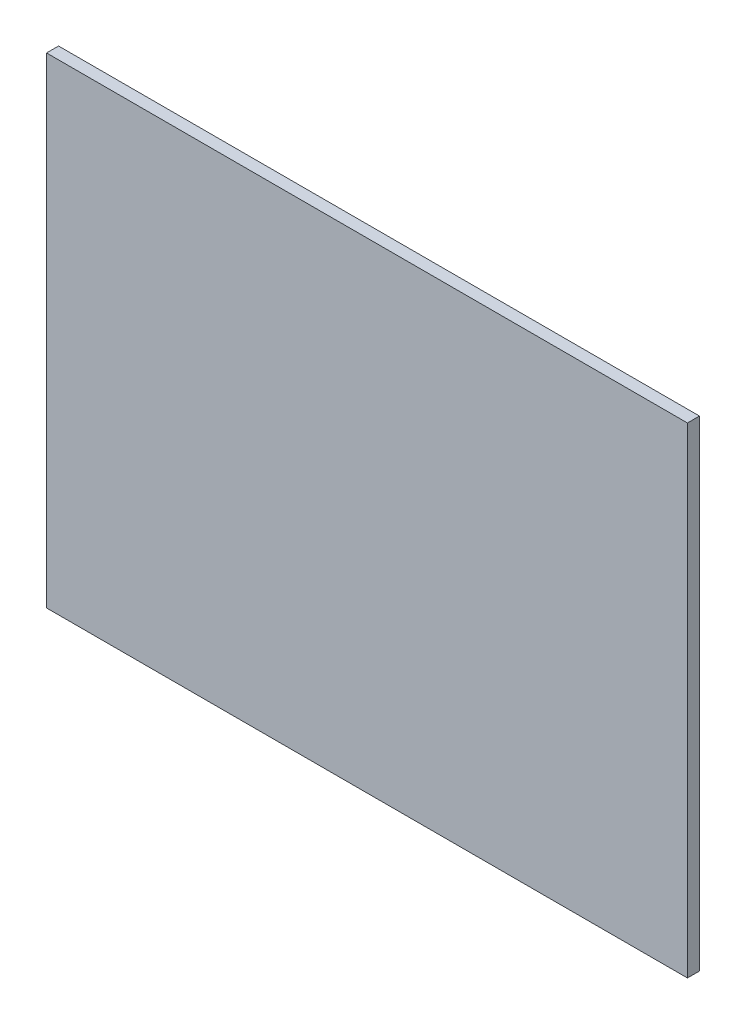
ISO-10303-21;
HEADER;
FILE_DESCRIPTION(('STEP AP214'),'2;1');
FILE_NAME('part.step','',(''),(''),'','','');
FILE_SCHEMA(('AUTOMOTIVE_DESIGN { 1 0 10303 214 1 1 1 1 }'));
ENDSEC;
DATA;
#1=APPLICATION_CONTEXT('core data for automotive mechanical design processes');
#2=APPLICATION_PROTOCOL_DEFINITION('international standard','automotive_design',2000,#1);
#3=PRODUCT_CONTEXT('',#1,'mechanical');
#4=PRODUCT('Part','Part','',(#3));
#5=PRODUCT_RELATED_PRODUCT_CATEGORY('part','',(#4));
#6=PRODUCT_DEFINITION_FORMATION('','',#4);
#7=PRODUCT_DEFINITION_CONTEXT('part definition',#1,'design');
#8=PRODUCT_DEFINITION('design','',#6,#7);
#9=PRODUCT_DEFINITION_SHAPE('','',#8);
#10=(LENGTH_UNIT() NAMED_UNIT(*) SI_UNIT(.MILLI.,.METRE.));
#11=(NAMED_UNIT(*) PLANE_ANGLE_UNIT() SI_UNIT($,.RADIAN.));
#12=(NAMED_UNIT(*) SI_UNIT($,.STERADIAN.) SOLID_ANGLE_UNIT());
#13=UNCERTAINTY_MEASURE_WITH_UNIT(LENGTH_MEASURE(1.E-05),#10,'distance_accuracy_value','');
#14=(GEOMETRIC_REPRESENTATION_CONTEXT(3) GLOBAL_UNCERTAINTY_ASSIGNED_CONTEXT((#13)) GLOBAL_UNIT_ASSIGNED_CONTEXT((#10,
#11,#12)) REPRESENTATION_CONTEXT('',''));
#15=CARTESIAN_POINT('',(0.,0.,0.));
#16=DIRECTION('',(0.,0.,1.));
#17=DIRECTION('',(1.,0.,0.));
#18=AXIS2_PLACEMENT_3D('',#15,#16,#17);
#19=CARTESIAN_POINT('',(0.,0.,19.05));
#20=DIRECTION('',(1.,0.,0.));
#21=DIRECTION('',(0.,0.,-1.));
#22=AXIS2_PLACEMENT_3D('',#19,#20,#21);
#23=PLANE('',#22);
#24=DIRECTION('',(0.,-1.,0.));
#25=VECTOR('',#24,1.);
#26=CARTESIAN_POINT('',(0.,0.,0.));
#27=LINE('',#26,#25);
#28=CARTESIAN_POINT('',(0.,762.,0.));
#29=VERTEX_POINT('',#28);
#30=CARTESIAN_POINT('',(0.,0.,0.));
#31=VERTEX_POINT('',#30);
#32=EDGE_CURVE('E96',#29,#31,#27,.T.);
#33=ORIENTED_EDGE('',*,*,#32,.T.);
#34=DIRECTION('',(0.,0.,-1.));
#35=VECTOR('',#34,1.);
#36=CARTESIAN_POINT('',(0.,0.,19.05));
#37=LINE('',#36,#35);
#38=CARTESIAN_POINT('',(0.,0.,19.05));
#39=VERTEX_POINT('',#38);
#40=EDGE_CURVE('E11',#39,#31,#37,.T.);
#41=ORIENTED_EDGE('',*,*,#40,.F.);
#42=DIRECTION('',(0.,-1.,0.));
#43=VECTOR('',#42,1.);
#44=CARTESIAN_POINT('',(0.,0.,19.05));
#45=LINE('',#44,#43);
#46=CARTESIAN_POINT('',(0.,762.,19.05));
#47=VERTEX_POINT('',#46);
#48=EDGE_CURVE('E84',#47,#39,#45,.T.);
#49=ORIENTED_EDGE('',*,*,#48,.F.);
#50=DIRECTION('',(0.,0.,-1.));
#51=VECTOR('',#50,1.);
#52=CARTESIAN_POINT('',(0.,762.,19.05));
#53=LINE('',#52,#51);
#54=EDGE_CURVE('E92',#47,#29,#53,.T.);
#55=ORIENTED_EDGE('',*,*,#54,.T.);
#56=EDGE_LOOP('',(#33,#41,#49,#55));
#57=FACE_BOUND('',#56,.T.);
#58=ADVANCED_FACE('F33',(#57),#23,.F.);
#59=CARTESIAN_POINT('',(0.,0.,19.05));
#60=DIRECTION('',(0.,1.,0.));
#61=DIRECTION('',(0.,0.,1.));
#62=AXIS2_PLACEMENT_3D('',#59,#60,#61);
#63=PLANE('',#62);
#64=DIRECTION('',(1.,0.,0.));
#65=VECTOR('',#64,1.);
#66=CARTESIAN_POINT('',(0.,0.,0.));
#67=LINE('',#66,#65);
#68=CARTESIAN_POINT('',(1016.,0.,0.));
#69=VERTEX_POINT('',#68);
#70=EDGE_CURVE('E88',#31,#69,#67,.T.);
#71=ORIENTED_EDGE('',*,*,#70,.T.);
#72=DIRECTION('',(0.,0.,-1.));
#73=VECTOR('',#72,1.);
#74=CARTESIAN_POINT('',(1016.,0.,19.05));
#75=LINE('',#74,#73);
#76=CARTESIAN_POINT('',(1016.,0.,19.05));
#77=VERTEX_POINT('',#76);
#78=EDGE_CURVE('E41',#77,#69,#75,.T.);
#79=ORIENTED_EDGE('',*,*,#78,.F.);
#80=DIRECTION('',(1.,0.,0.));
#81=VECTOR('',#80,1.);
#82=CARTESIAN_POINT('',(0.,0.,19.05));
#83=LINE('',#82,#81);
#84=EDGE_CURVE('E79',#39,#77,#83,.T.);
#85=ORIENTED_EDGE('',*,*,#84,.F.);
#86=ORIENTED_EDGE('',*,*,#40,.T.);
#87=EDGE_LOOP('',(#71,#79,#85,#86));
#88=FACE_BOUND('',#87,.T.);
#89=ADVANCED_FACE('F87',(#88),#63,.F.);
#90=CARTESIAN_POINT('',(1016.,0.,19.05));
#91=DIRECTION('',(-1.,0.,0.));
#92=DIRECTION('',(0.,0.,1.));
#93=AXIS2_PLACEMENT_3D('',#90,#91,#92);
#94=PLANE('',#93);
#95=DIRECTION('',(0.,1.,0.));
#96=VECTOR('',#95,1.);
#97=CARTESIAN_POINT('',(1016.,0.,0.));
#98=LINE('',#97,#96);
#99=CARTESIAN_POINT('',(1016.,762.,0.));
#100=VERTEX_POINT('',#99);
#101=EDGE_CURVE('E66',#69,#100,#98,.T.);
#102=ORIENTED_EDGE('',*,*,#101,.T.);
#103=DIRECTION('',(0.,0.,-1.));
#104=VECTOR('',#103,1.);
#105=CARTESIAN_POINT('',(1016.,762.,19.05));
#106=LINE('',#105,#104);
#107=CARTESIAN_POINT('',(1016.,762.,19.05));
#108=VERTEX_POINT('',#107);
#109=EDGE_CURVE('E89',#108,#100,#106,.T.);
#110=ORIENTED_EDGE('',*,*,#109,.F.);
#111=DIRECTION('',(0.,1.,0.));
#112=VECTOR('',#111,1.);
#113=CARTESIAN_POINT('',(1016.,0.,19.05));
#114=LINE('',#113,#112);
#115=EDGE_CURVE('E82',#77,#108,#114,.T.);
#116=ORIENTED_EDGE('',*,*,#115,.F.);
#117=ORIENTED_EDGE('',*,*,#78,.T.);
#118=EDGE_LOOP('',(#102,#110,#116,#117));
#119=FACE_BOUND('',#118,.T.);
#120=ADVANCED_FACE('F90',(#119),#94,.F.);
#121=CARTESIAN_POINT('',(0.,762.,19.05));
#122=DIRECTION('',(0.,-1.,0.));
#123=DIRECTION('',(0.,0.,-1.));
#124=AXIS2_PLACEMENT_3D('',#121,#122,#123);
#125=PLANE('',#124);
#126=DIRECTION('',(-1.,0.,0.));
#127=VECTOR('',#126,1.);
#128=CARTESIAN_POINT('',(0.,762.,0.));
#129=LINE('',#128,#127);
#130=EDGE_CURVE('E72',#100,#29,#129,.T.);
#131=ORIENTED_EDGE('',*,*,#130,.T.);
#132=ORIENTED_EDGE('',*,*,#54,.F.);
#133=DIRECTION('',(-1.,0.,0.));
#134=VECTOR('',#133,1.);
#135=CARTESIAN_POINT('',(0.,762.,19.05));
#136=LINE('',#135,#134);
#137=EDGE_CURVE('E49',#108,#47,#136,.T.);
#138=ORIENTED_EDGE('',*,*,#137,.F.);
#139=ORIENTED_EDGE('',*,*,#109,.T.);
#140=EDGE_LOOP('',(#131,#132,#138,#139));
#141=FACE_BOUND('',#140,.T.);
#142=ADVANCED_FACE('F103',(#141),#125,.F.);
#143=CARTESIAN_POINT('',(0.,0.,19.05));
#144=DIRECTION('',(0.,0.,-1.));
#145=DIRECTION('',(-1.,0.,0.));
#146=AXIS2_PLACEMENT_3D('',#143,#144,#145);
#147=PLANE('',#146);
#148=ORIENTED_EDGE('',*,*,#48,.T.);
#149=ORIENTED_EDGE('',*,*,#84,.T.);
#150=ORIENTED_EDGE('',*,*,#115,.T.);
#151=ORIENTED_EDGE('',*,*,#137,.T.);
#152=EDGE_LOOP('',(#148,#149,#150,#151));
#153=FACE_BOUND('',#152,.T.);
#154=ADVANCED_FACE('F80',(#153),#147,.F.);
#155=CARTESIAN_POINT('',(0.,0.,0.));
#156=DIRECTION('',(0.,0.,-1.));
#157=DIRECTION('',(-1.,0.,0.));
#158=AXIS2_PLACEMENT_3D('',#155,#156,#157);
#159=PLANE('',#158);
#160=ORIENTED_EDGE('',*,*,#32,.F.);
#161=ORIENTED_EDGE('',*,*,#130,.F.);
#162=ORIENTED_EDGE('',*,*,#101,.F.);
#163=ORIENTED_EDGE('',*,*,#70,.F.);
#164=EDGE_LOOP('',(#160,#161,#162,#163));
#165=FACE_BOUND('',#164,.T.);
#166=ADVANCED_FACE('F106',(#165),#159,.T.);
#167=CLOSED_SHELL('',(#58,#89,#120,#142,#154,#166));
#168=MANIFOLD_SOLID_BREP('B2',#167);
#169=ADVANCED_BREP_SHAPE_REPRESENTATION('',(#18,#168),#14);
#170=SHAPE_DEFINITION_REPRESENTATION(#9,#169);
ENDSEC;
END-ISO-10303-21;
